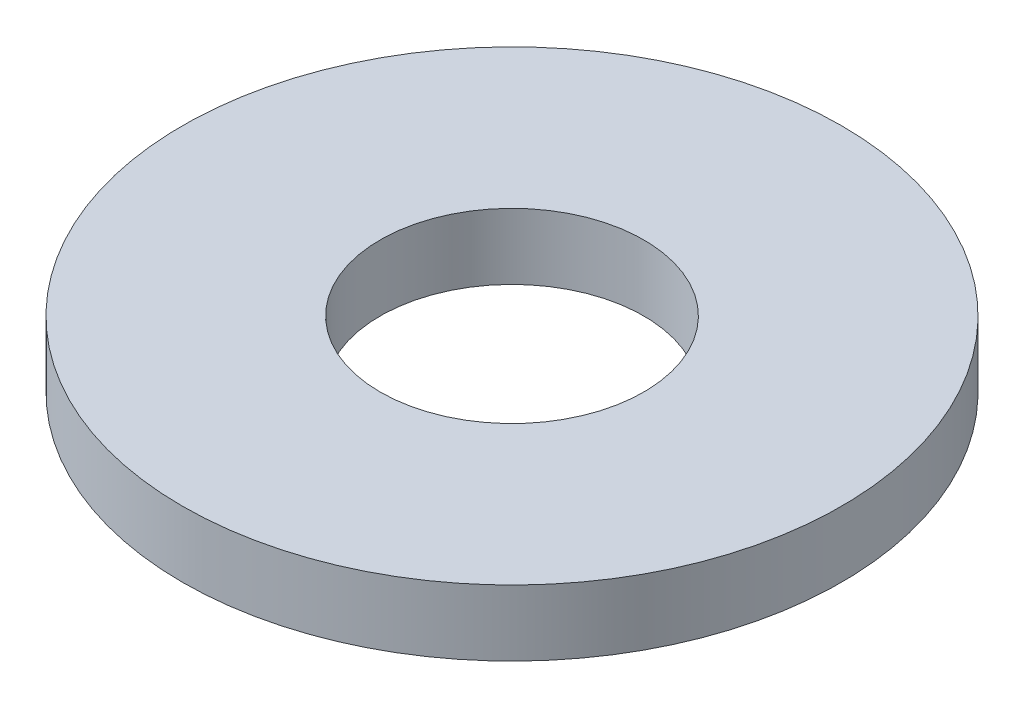
ISO-10303-21;
HEADER;
FILE_DESCRIPTION(('STEP AP214'),'2;1');
FILE_NAME('part.step','',(''),(''),'','','');
FILE_SCHEMA(('AUTOMOTIVE_DESIGN { 1 0 10303 214 1 1 1 1 }'));
ENDSEC;
DATA;
#1=APPLICATION_CONTEXT('core data for automotive mechanical design processes');
#2=APPLICATION_PROTOCOL_DEFINITION('international standard','automotive_design',2000,#1);
#3=PRODUCT_CONTEXT('',#1,'mechanical');
#4=PRODUCT('Part','Part','',(#3));
#5=PRODUCT_RELATED_PRODUCT_CATEGORY('part','',(#4));
#6=PRODUCT_DEFINITION_FORMATION('','',#4);
#7=PRODUCT_DEFINITION_CONTEXT('part definition',#1,'design');
#8=PRODUCT_DEFINITION('design','',#6,#7);
#9=PRODUCT_DEFINITION_SHAPE('','',#8);
#10=(LENGTH_UNIT() NAMED_UNIT(*) SI_UNIT(.MILLI.,.METRE.));
#11=(NAMED_UNIT(*) PLANE_ANGLE_UNIT() SI_UNIT($,.RADIAN.));
#12=(NAMED_UNIT(*) SI_UNIT($,.STERADIAN.) SOLID_ANGLE_UNIT());
#13=UNCERTAINTY_MEASURE_WITH_UNIT(LENGTH_MEASURE(1.E-05),#10,'distance_accuracy_value','');
#14=(GEOMETRIC_REPRESENTATION_CONTEXT(3) GLOBAL_UNCERTAINTY_ASSIGNED_CONTEXT((#13)) GLOBAL_UNIT_ASSIGNED_CONTEXT((#10,
#11,#12)) REPRESENTATION_CONTEXT('',''));
#15=CARTESIAN_POINT('',(0.,0.,0.));
#16=DIRECTION('',(0.,0.,1.));
#17=DIRECTION('',(1.,0.,0.));
#18=AXIS2_PLACEMENT_3D('',#15,#16,#17);
#19=CARTESIAN_POINT('',(0.,1.,0.));
#20=DIRECTION('',(0.,1.,0.));
#21=DIRECTION('',(0.,0.,1.));
#22=AXIS2_PLACEMENT_3D('',#19,#20,#21);
#23=PLANE('',#22);
#24=CARTESIAN_POINT('',(0.,1.,0.));
#25=DIRECTION('',(0.,1.,0.));
#26=DIRECTION('',(0.,0.,1.));
#27=AXIS2_PLACEMENT_3D('',#24,#25,#26);
#28=CIRCLE('',#27,5.);
#29=CARTESIAN_POINT('',(0.,1.,5.));
#30=VERTEX_POINT('',#29);
#31=EDGE_CURVE('E10',#30,#30,#28,.T.);
#32=ORIENTED_EDGE('',*,*,#31,.T.);
#33=EDGE_LOOP('',(#32));
#34=FACE_BOUND('',#33,.T.);
#35=CARTESIAN_POINT('',(0.,1.,0.));
#36=DIRECTION('',(0.,1.,0.));
#37=DIRECTION('',(0.,0.,1.));
#38=AXIS2_PLACEMENT_3D('',#35,#36,#37);
#39=CIRCLE('',#38,2.);
#40=CARTESIAN_POINT('',(0.,1.,2.));
#41=VERTEX_POINT('',#40);
#42=EDGE_CURVE('E41',#41,#41,#39,.T.);
#43=ORIENTED_EDGE('',*,*,#42,.F.);
#44=EDGE_LOOP('',(#43));
#45=FACE_BOUND('',#44,.T.);
#46=ADVANCED_FACE('F30',(#34,#45),#23,.T.);
#47=CARTESIAN_POINT('',(0.,0.,0.));
#48=DIRECTION('',(0.,1.,0.));
#49=DIRECTION('',(0.,0.,1.));
#50=AXIS2_PLACEMENT_3D('',#47,#48,#49);
#51=PLANE('',#50);
#52=CARTESIAN_POINT('',(0.,0.,0.));
#53=DIRECTION('',(0.,1.,0.));
#54=DIRECTION('',(0.,0.,1.));
#55=AXIS2_PLACEMENT_3D('',#52,#53,#54);
#56=CIRCLE('',#55,5.);
#57=CARTESIAN_POINT('',(0.,0.,5.));
#58=VERTEX_POINT('',#57);
#59=EDGE_CURVE('E34',#58,#58,#56,.T.);
#60=ORIENTED_EDGE('',*,*,#59,.F.);
#61=EDGE_LOOP('',(#60));
#62=FACE_BOUND('',#61,.T.);
#63=CARTESIAN_POINT('',(0.,0.,0.));
#64=DIRECTION('',(0.,1.,0.));
#65=DIRECTION('',(0.,0.,1.));
#66=AXIS2_PLACEMENT_3D('',#63,#64,#65);
#67=CIRCLE('',#66,2.);
#68=CARTESIAN_POINT('',(0.,0.,2.));
#69=VERTEX_POINT('',#68);
#70=EDGE_CURVE('E43',#69,#69,#67,.T.);
#71=ORIENTED_EDGE('',*,*,#70,.T.);
#72=EDGE_LOOP('',(#71));
#73=FACE_BOUND('',#72,.T.);
#74=ADVANCED_FACE('F53',(#62,#73),#51,.F.);
#75=CARTESIAN_POINT('',(0.,1.,0.));
#76=DIRECTION('',(0.,-1.,0.));
#77=DIRECTION('',(0.,0.,-1.));
#78=AXIS2_PLACEMENT_3D('',#75,#76,#77);
#79=CYLINDRICAL_SURFACE('',#78,5.);
#80=ORIENTED_EDGE('',*,*,#31,.F.);
#81=EDGE_LOOP('',(#80));
#82=FACE_BOUND('',#81,.T.);
#83=ORIENTED_EDGE('',*,*,#59,.T.);
#84=EDGE_LOOP('',(#83));
#85=FACE_BOUND('',#84,.T.);
#86=ADVANCED_FACE('F32',(#82,#85),#79,.T.);
#87=CARTESIAN_POINT('',(0.,1.,0.));
#88=DIRECTION('',(0.,-1.,0.));
#89=DIRECTION('',(0.,0.,-1.));
#90=AXIS2_PLACEMENT_3D('',#87,#88,#89);
#91=CYLINDRICAL_SURFACE('',#90,2.);
#92=ORIENTED_EDGE('',*,*,#42,.T.);
#93=EDGE_LOOP('',(#92));
#94=FACE_BOUND('',#93,.T.);
#95=ORIENTED_EDGE('',*,*,#70,.F.);
#96=EDGE_LOOP('',(#95));
#97=FACE_BOUND('',#96,.T.);
#98=ADVANCED_FACE('F49',(#94,#97),#91,.F.);
#99=CLOSED_SHELL('',(#46,#74,#86,#98));
#100=MANIFOLD_SOLID_BREP('B2',#99);
#101=ADVANCED_BREP_SHAPE_REPRESENTATION('',(#18,#100),#14);
#102=SHAPE_DEFINITION_REPRESENTATION(#9,#101);
ENDSEC;
END-ISO-10303-21;
